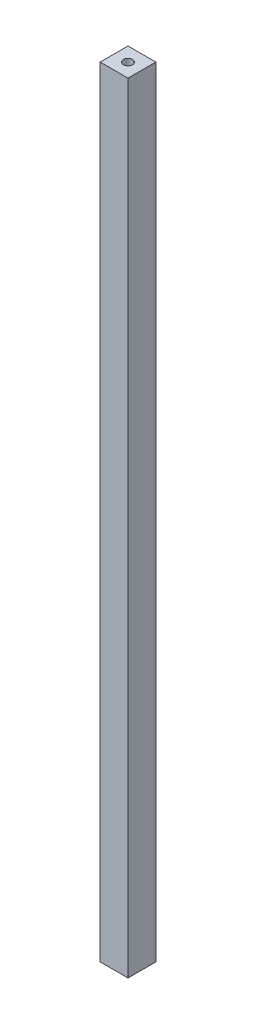
ISO-10303-21;
HEADER;
FILE_DESCRIPTION(('STEP AP214'),'2;1');
FILE_NAME('part.step','',(''),(''),'','','');
FILE_SCHEMA(('AUTOMOTIVE_DESIGN { 1 0 10303 214 1 1 1 1 }'));
ENDSEC;
DATA;
#1=APPLICATION_CONTEXT('core data for automotive mechanical design processes');
#2=APPLICATION_PROTOCOL_DEFINITION('international standard','automotive_design',2000,#1);
#3=PRODUCT_CONTEXT('',#1,'mechanical');
#4=PRODUCT('Part','Part','',(#3));
#5=PRODUCT_RELATED_PRODUCT_CATEGORY('part','',(#4));
#6=PRODUCT_DEFINITION_FORMATION('','',#4);
#7=PRODUCT_DEFINITION_CONTEXT('part definition',#1,'design');
#8=PRODUCT_DEFINITION('design','',#6,#7);
#9=PRODUCT_DEFINITION_SHAPE('','',#8);
#10=(LENGTH_UNIT() NAMED_UNIT(*) SI_UNIT(.MILLI.,.METRE.));
#11=(NAMED_UNIT(*) PLANE_ANGLE_UNIT() SI_UNIT($,.RADIAN.));
#12=(NAMED_UNIT(*) SI_UNIT($,.STERADIAN.) SOLID_ANGLE_UNIT());
#13=UNCERTAINTY_MEASURE_WITH_UNIT(LENGTH_MEASURE(1.E-05),#10,'distance_accuracy_value','');
#14=(GEOMETRIC_REPRESENTATION_CONTEXT(3) GLOBAL_UNCERTAINTY_ASSIGNED_CONTEXT((#13)) GLOBAL_UNIT_ASSIGNED_CONTEXT((#10,
#11,#12)) REPRESENTATION_CONTEXT('',''));
#15=CARTESIAN_POINT('',(0.,0.,0.));
#16=DIRECTION('',(0.,0.,1.));
#17=DIRECTION('',(1.,0.,0.));
#18=AXIS2_PLACEMENT_3D('',#15,#16,#17);
#19=CARTESIAN_POINT('',(0.,420.,0.));
#20=DIRECTION('',(0.,1.,0.));
#21=DIRECTION('',(0.,0.,1.));
#22=AXIS2_PLACEMENT_3D('',#19,#20,#21);
#23=PLANE('',#22);
#24=DIRECTION('',(0.,0.,1.));
#25=VECTOR('',#24,1.);
#26=CARTESIAN_POINT('',(-7.5,420.,7.5));
#27=LINE('',#26,#25);
#28=CARTESIAN_POINT('',(-7.5,420.,-7.5));
#29=VERTEX_POINT('',#28);
#30=CARTESIAN_POINT('',(-7.5,420.,7.5));
#31=VERTEX_POINT('',#30);
#32=EDGE_CURVE('E85',#29,#31,#27,.T.);
#33=ORIENTED_EDGE('',*,*,#32,.T.);
#34=DIRECTION('',(1.,0.,0.));
#35=VECTOR('',#34,1.);
#36=CARTESIAN_POINT('',(7.5,420.,7.5));
#37=LINE('',#36,#35);
#38=CARTESIAN_POINT('',(7.5,420.,7.5));
#39=VERTEX_POINT('',#38);
#40=EDGE_CURVE('E80',#31,#39,#37,.T.);
#41=ORIENTED_EDGE('',*,*,#40,.T.);
#42=DIRECTION('',(0.,0.,-1.));
#43=VECTOR('',#42,1.);
#44=CARTESIAN_POINT('',(7.5,420.,7.5));
#45=LINE('',#44,#43);
#46=CARTESIAN_POINT('',(7.5,420.,-7.5));
#47=VERTEX_POINT('',#46);
#48=EDGE_CURVE('E83',#39,#47,#45,.T.);
#49=ORIENTED_EDGE('',*,*,#48,.T.);
#50=DIRECTION('',(-1.,0.,0.));
#51=VECTOR('',#50,1.);
#52=CARTESIAN_POINT('',(7.5,420.,-7.5));
#53=LINE('',#52,#51);
#54=EDGE_CURVE('E50',#47,#29,#53,.T.);
#55=ORIENTED_EDGE('',*,*,#54,.T.);
#56=EDGE_LOOP('',(#33,#41,#49,#55));
#57=FACE_BOUND('',#56,.T.);
#58=CARTESIAN_POINT('',(0.,420.,0.));
#59=DIRECTION('',(0.,1.,0.));
#60=DIRECTION('',(0.,0.,1.));
#61=AXIS2_PLACEMENT_3D('',#58,#59,#60);
#62=CIRCLE('',#61,2.5);
#63=CARTESIAN_POINT('',(0.,420.,2.5));
#64=VERTEX_POINT('',#63);
#65=EDGE_CURVE('E100',#64,#64,#62,.T.);
#66=ORIENTED_EDGE('',*,*,#65,.F.);
#67=EDGE_LOOP('',(#66));
#68=FACE_BOUND('',#67,.T.);
#69=ADVANCED_FACE('F33',(#57,#68),#23,.T.);
#70=CARTESIAN_POINT('',(0.,0.,0.));
#71=DIRECTION('',(0.,1.,0.));
#72=DIRECTION('',(0.,0.,1.));
#73=AXIS2_PLACEMENT_3D('',#70,#71,#72);
#74=PLANE('',#73);
#75=DIRECTION('',(0.,0.,1.));
#76=VECTOR('',#75,1.);
#77=CARTESIAN_POINT('',(-7.5,0.,7.5));
#78=LINE('',#77,#76);
#79=CARTESIAN_POINT('',(-7.5,0.,-7.5));
#80=VERTEX_POINT('',#79);
#81=CARTESIAN_POINT('',(-7.5,0.,7.5));
#82=VERTEX_POINT('',#81);
#83=EDGE_CURVE('E97',#80,#82,#78,.T.);
#84=ORIENTED_EDGE('',*,*,#83,.F.);
#85=DIRECTION('',(-1.,0.,0.));
#86=VECTOR('',#85,1.);
#87=CARTESIAN_POINT('',(7.5,0.,-7.5));
#88=LINE('',#87,#86);
#89=CARTESIAN_POINT('',(7.5,0.,-7.5));
#90=VERTEX_POINT('',#89);
#91=EDGE_CURVE('E73',#90,#80,#88,.T.);
#92=ORIENTED_EDGE('',*,*,#91,.F.);
#93=DIRECTION('',(0.,0.,-1.));
#94=VECTOR('',#93,1.);
#95=CARTESIAN_POINT('',(7.5,0.,7.5));
#96=LINE('',#95,#94);
#97=CARTESIAN_POINT('',(7.5,0.,7.5));
#98=VERTEX_POINT('',#97);
#99=EDGE_CURVE('E67',#98,#90,#96,.T.);
#100=ORIENTED_EDGE('',*,*,#99,.F.);
#101=DIRECTION('',(1.,0.,0.));
#102=VECTOR('',#101,1.);
#103=CARTESIAN_POINT('',(7.5,0.,7.5));
#104=LINE('',#103,#102);
#105=EDGE_CURVE('E89',#82,#98,#104,.T.);
#106=ORIENTED_EDGE('',*,*,#105,.F.);
#107=EDGE_LOOP('',(#84,#92,#100,#106));
#108=FACE_BOUND('',#107,.T.);
#109=CARTESIAN_POINT('',(0.,0.,0.));
#110=DIRECTION('',(0.,1.,0.));
#111=DIRECTION('',(0.,0.,1.));
#112=AXIS2_PLACEMENT_3D('',#109,#110,#111);
#113=CIRCLE('',#112,2.5);
#114=CARTESIAN_POINT('',(0.,0.,2.5));
#115=VERTEX_POINT('',#114);
#116=EDGE_CURVE('E112',#115,#115,#113,.T.);
#117=ORIENTED_EDGE('',*,*,#116,.T.);
#118=EDGE_LOOP('',(#117));
#119=FACE_BOUND('',#118,.T.);
#120=ADVANCED_FACE('F108',(#108,#119),#74,.F.);
#121=CARTESIAN_POINT('',(-7.5,420.,7.5));
#122=DIRECTION('',(1.,0.,0.));
#123=DIRECTION('',(0.,0.,-1.));
#124=AXIS2_PLACEMENT_3D('',#121,#122,#123);
#125=PLANE('',#124);
#126=ORIENTED_EDGE('',*,*,#83,.T.);
#127=DIRECTION('',(0.,-1.,0.));
#128=VECTOR('',#127,1.);
#129=CARTESIAN_POINT('',(-7.5,420.,7.5));
#130=LINE('',#129,#128);
#131=EDGE_CURVE('E11',#31,#82,#130,.T.);
#132=ORIENTED_EDGE('',*,*,#131,.F.);
#133=ORIENTED_EDGE('',*,*,#32,.F.);
#134=DIRECTION('',(0.,-1.,0.));
#135=VECTOR('',#134,1.);
#136=CARTESIAN_POINT('',(-7.5,420.,-7.5));
#137=LINE('',#136,#135);
#138=EDGE_CURVE('E93',#29,#80,#137,.T.);
#139=ORIENTED_EDGE('',*,*,#138,.T.);
#140=EDGE_LOOP('',(#126,#132,#133,#139));
#141=FACE_BOUND('',#140,.T.);
#142=ADVANCED_FACE('F35',(#141),#125,.F.);
#143=CARTESIAN_POINT('',(7.5,420.,7.5));
#144=DIRECTION('',(0.,0.,-1.));
#145=DIRECTION('',(-1.,0.,0.));
#146=AXIS2_PLACEMENT_3D('',#143,#144,#145);
#147=PLANE('',#146);
#148=ORIENTED_EDGE('',*,*,#105,.T.);
#149=DIRECTION('',(0.,-1.,0.));
#150=VECTOR('',#149,1.);
#151=CARTESIAN_POINT('',(7.5,420.,7.5));
#152=LINE('',#151,#150);
#153=EDGE_CURVE('E42',#39,#98,#152,.T.);
#154=ORIENTED_EDGE('',*,*,#153,.F.);
#155=ORIENTED_EDGE('',*,*,#40,.F.);
#156=ORIENTED_EDGE('',*,*,#131,.T.);
#157=EDGE_LOOP('',(#148,#154,#155,#156));
#158=FACE_BOUND('',#157,.T.);
#159=ADVANCED_FACE('F88',(#158),#147,.F.);
#160=CARTESIAN_POINT('',(7.5,420.,7.5));
#161=DIRECTION('',(-1.,0.,0.));
#162=DIRECTION('',(0.,0.,1.));
#163=AXIS2_PLACEMENT_3D('',#160,#161,#162);
#164=PLANE('',#163);
#165=ORIENTED_EDGE('',*,*,#99,.T.);
#166=DIRECTION('',(0.,-1.,0.));
#167=VECTOR('',#166,1.);
#168=CARTESIAN_POINT('',(7.5,420.,-7.5));
#169=LINE('',#168,#167);
#170=EDGE_CURVE('E90',#47,#90,#169,.T.);
#171=ORIENTED_EDGE('',*,*,#170,.F.);
#172=ORIENTED_EDGE('',*,*,#48,.F.);
#173=ORIENTED_EDGE('',*,*,#153,.T.);
#174=EDGE_LOOP('',(#165,#171,#172,#173));
#175=FACE_BOUND('',#174,.T.);
#176=ADVANCED_FACE('F91',(#175),#164,.F.);
#177=CARTESIAN_POINT('',(7.5,420.,-7.5));
#178=DIRECTION('',(0.,0.,1.));
#179=DIRECTION('',(1.,0.,0.));
#180=AXIS2_PLACEMENT_3D('',#177,#178,#179);
#181=PLANE('',#180);
#182=ORIENTED_EDGE('',*,*,#91,.T.);
#183=ORIENTED_EDGE('',*,*,#138,.F.);
#184=ORIENTED_EDGE('',*,*,#54,.F.);
#185=ORIENTED_EDGE('',*,*,#170,.T.);
#186=EDGE_LOOP('',(#182,#183,#184,#185));
#187=FACE_BOUND('',#186,.T.);
#188=ADVANCED_FACE('F105',(#187),#181,.F.);
#189=CARTESIAN_POINT('',(0.,420.,0.));
#190=DIRECTION('',(0.,-1.,0.));
#191=DIRECTION('',(0.,0.,-1.));
#192=AXIS2_PLACEMENT_3D('',#189,#190,#191);
#193=CYLINDRICAL_SURFACE('',#192,2.5);
#194=ORIENTED_EDGE('',*,*,#65,.T.);
#195=EDGE_LOOP('',(#194));
#196=FACE_BOUND('',#195,.T.);
#197=ORIENTED_EDGE('',*,*,#116,.F.);
#198=EDGE_LOOP('',(#197));
#199=FACE_BOUND('',#198,.T.);
#200=ADVANCED_FACE('F118',(#196,#199),#193,.F.);
#201=CLOSED_SHELL('',(#69,#120,#142,#159,#176,#188,#200));
#202=MANIFOLD_SOLID_BREP('B2',#201);
#203=ADVANCED_BREP_SHAPE_REPRESENTATION('',(#18,#202),#14);
#204=SHAPE_DEFINITION_REPRESENTATION(#9,#203);
ENDSEC;
END-ISO-10303-21;
